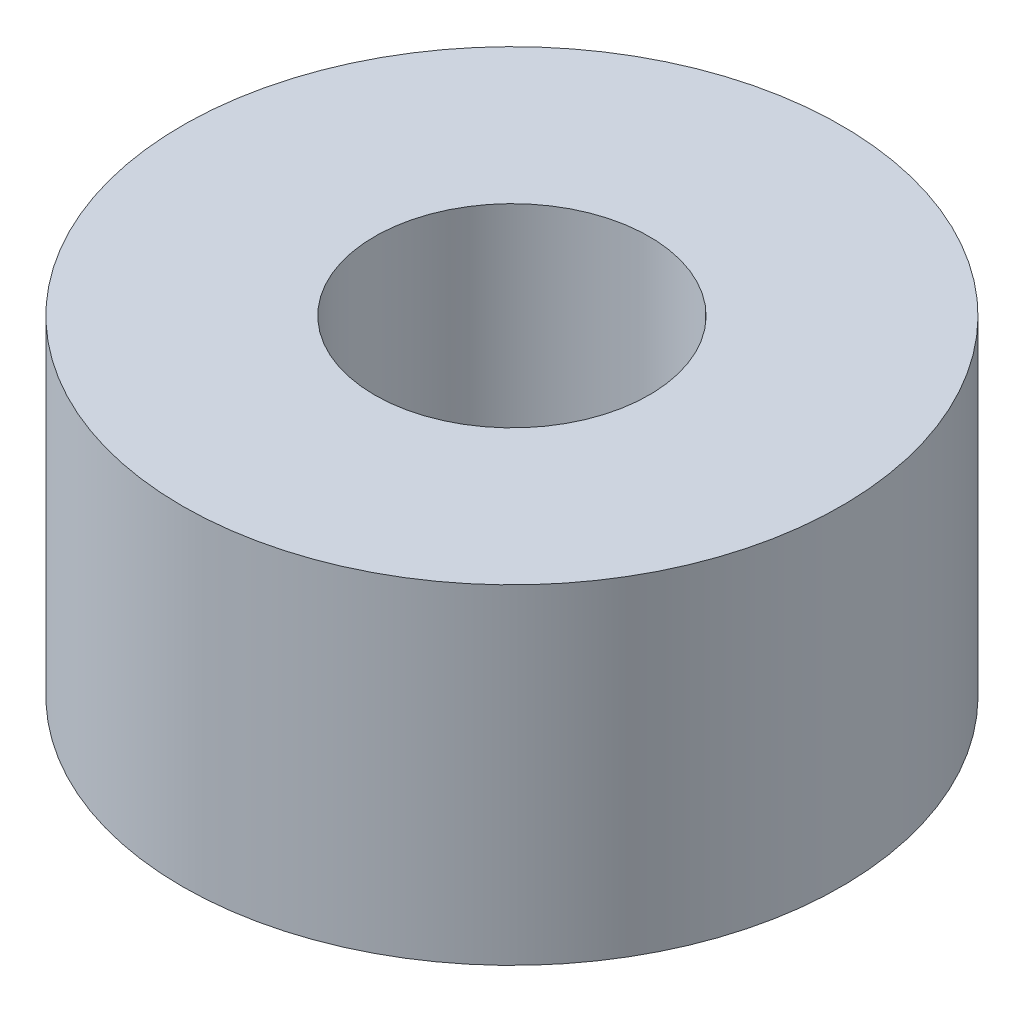
ISO-10303-21;
HEADER;
FILE_DESCRIPTION(('STEP AP214'),'2;1');
FILE_NAME('part.step','',(''),(''),'','','');
FILE_SCHEMA(('AUTOMOTIVE_DESIGN { 1 0 10303 214 1 1 1 1 }'));
ENDSEC;
DATA;
#1=APPLICATION_CONTEXT('core data for automotive mechanical design processes');
#2=APPLICATION_PROTOCOL_DEFINITION('international standard','automotive_design',2000,#1);
#3=PRODUCT_CONTEXT('',#1,'mechanical');
#4=PRODUCT('Part','Part','',(#3));
#5=PRODUCT_RELATED_PRODUCT_CATEGORY('part','',(#4));
#6=PRODUCT_DEFINITION_FORMATION('','',#4);
#7=PRODUCT_DEFINITION_CONTEXT('part definition',#1,'design');
#8=PRODUCT_DEFINITION('design','',#6,#7);
#9=PRODUCT_DEFINITION_SHAPE('','',#8);
#10=(LENGTH_UNIT() NAMED_UNIT(*) SI_UNIT(.MILLI.,.METRE.));
#11=(NAMED_UNIT(*) PLANE_ANGLE_UNIT() SI_UNIT($,.RADIAN.));
#12=(NAMED_UNIT(*) SI_UNIT($,.STERADIAN.) SOLID_ANGLE_UNIT());
#13=UNCERTAINTY_MEASURE_WITH_UNIT(LENGTH_MEASURE(1.E-05),#10,'distance_accuracy_value','');
#14=(GEOMETRIC_REPRESENTATION_CONTEXT(3) GLOBAL_UNCERTAINTY_ASSIGNED_CONTEXT((#13)) GLOBAL_UNIT_ASSIGNED_CONTEXT((#10,
#11,#12)) REPRESENTATION_CONTEXT('',''));
#15=CARTESIAN_POINT('',(0.,0.,0.));
#16=DIRECTION('',(0.,0.,1.));
#17=DIRECTION('',(1.,0.,0.));
#18=AXIS2_PLACEMENT_3D('',#15,#16,#17);
#19=CARTESIAN_POINT('',(0.,3.,0.));
#20=DIRECTION('',(0.,1.,0.));
#21=DIRECTION('',(0.,0.,1.));
#22=AXIS2_PLACEMENT_3D('',#19,#20,#21);
#23=PLANE('',#22);
#24=CARTESIAN_POINT('',(0.,3.,0.));
#25=DIRECTION('',(0.,1.,0.));
#26=DIRECTION('',(0.,0.,1.));
#27=AXIS2_PLACEMENT_3D('',#24,#25,#26);
#28=CIRCLE('',#27,3.);
#29=CARTESIAN_POINT('',(0.,3.,3.));
#30=VERTEX_POINT('',#29);
#31=EDGE_CURVE('E10',#30,#30,#28,.T.);
#32=ORIENTED_EDGE('',*,*,#31,.T.);
#33=EDGE_LOOP('',(#32));
#34=FACE_BOUND('',#33,.T.);
#35=CARTESIAN_POINT('',(0.,3.,0.));
#36=DIRECTION('',(0.,1.,0.));
#37=DIRECTION('',(0.,0.,1.));
#38=AXIS2_PLACEMENT_3D('',#35,#36,#37);
#39=CIRCLE('',#38,1.25);
#40=CARTESIAN_POINT('',(0.,3.,1.25));
#41=VERTEX_POINT('',#40);
#42=EDGE_CURVE('E49',#41,#41,#39,.T.);
#43=ORIENTED_EDGE('',*,*,#42,.F.);
#44=EDGE_LOOP('',(#43));
#45=FACE_BOUND('',#44,.T.);
#46=ADVANCED_FACE('F39',(#34,#45),#23,.T.);
#47=CARTESIAN_POINT('',(0.,0.,0.));
#48=DIRECTION('',(0.,1.,0.));
#49=DIRECTION('',(0.,0.,1.));
#50=AXIS2_PLACEMENT_3D('',#47,#48,#49);
#51=PLANE('',#50);
#52=CARTESIAN_POINT('',(0.,0.,0.));
#53=DIRECTION('',(0.,1.,0.));
#54=DIRECTION('',(0.,0.,1.));
#55=AXIS2_PLACEMENT_3D('',#52,#53,#54);
#56=CIRCLE('',#55,3.);
#57=CARTESIAN_POINT('',(0.,0.,3.));
#58=VERTEX_POINT('',#57);
#59=EDGE_CURVE('E43',#58,#58,#56,.T.);
#60=ORIENTED_EDGE('',*,*,#59,.F.);
#61=EDGE_LOOP('',(#60));
#62=FACE_BOUND('',#61,.T.);
#63=CARTESIAN_POINT('',(0.,0.,0.));
#64=DIRECTION('',(0.,1.,0.));
#65=DIRECTION('',(0.,0.,1.));
#66=AXIS2_PLACEMENT_3D('',#63,#64,#65);
#67=CIRCLE('',#66,1.25);
#68=CARTESIAN_POINT('',(0.,0.,1.25));
#69=VERTEX_POINT('',#68);
#70=EDGE_CURVE('E55',#69,#69,#67,.T.);
#71=ORIENTED_EDGE('',*,*,#70,.T.);
#72=EDGE_LOOP('',(#71));
#73=FACE_BOUND('',#72,.T.);
#74=ADVANCED_FACE('F64',(#62,#73),#51,.F.);
#75=CARTESIAN_POINT('',(0.,3.,0.));
#76=DIRECTION('',(0.,-1.,0.));
#77=DIRECTION('',(0.,0.,-1.));
#78=AXIS2_PLACEMENT_3D('',#75,#76,#77);
#79=CYLINDRICAL_SURFACE('',#78,3.);
#80=ORIENTED_EDGE('',*,*,#31,.F.);
#81=EDGE_LOOP('',(#80));
#82=FACE_BOUND('',#81,.T.);
#83=ORIENTED_EDGE('',*,*,#59,.T.);
#84=EDGE_LOOP('',(#83));
#85=FACE_BOUND('',#84,.T.);
#86=ADVANCED_FACE('F41',(#82,#85),#79,.T.);
#87=CARTESIAN_POINT('',(0.,3.,0.));
#88=DIRECTION('',(0.,-1.,0.));
#89=DIRECTION('',(0.,0.,-1.));
#90=AXIS2_PLACEMENT_3D('',#87,#88,#89);
#91=CYLINDRICAL_SURFACE('',#90,1.25);
#92=ORIENTED_EDGE('',*,*,#42,.T.);
#93=EDGE_LOOP('',(#92));
#94=FACE_BOUND('',#93,.T.);
#95=ORIENTED_EDGE('',*,*,#70,.F.);
#96=EDGE_LOOP('',(#95));
#97=FACE_BOUND('',#96,.T.);
#98=ADVANCED_FACE('F59',(#94,#97),#91,.F.);
#99=CLOSED_SHELL('',(#46,#74,#86,#98));
#100=MANIFOLD_SOLID_BREP('B2',#99);
#101=ADVANCED_BREP_SHAPE_REPRESENTATION('',(#18,#100),#14);
#102=SHAPE_DEFINITION_REPRESENTATION(#9,#101);
ENDSEC;
END-ISO-10303-21;
